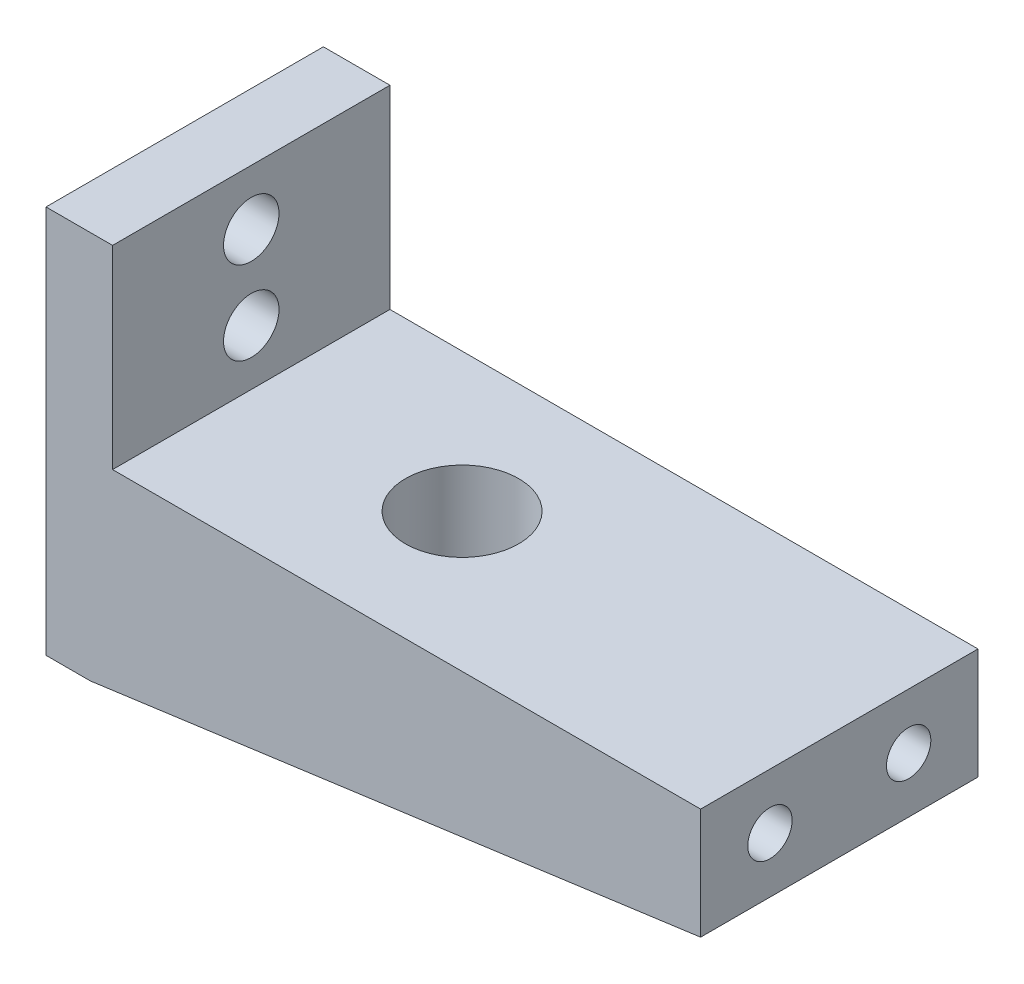
ISO-10303-21;
HEADER;
FILE_DESCRIPTION(('STEP AP214'),'2;1');
FILE_NAME('part.step','',(''),(''),'','','');
FILE_SCHEMA(('AUTOMOTIVE_DESIGN { 1 0 10303 214 1 1 1 1 }'));
ENDSEC;
DATA;
#1=APPLICATION_CONTEXT('core data for automotive mechanical design processes');
#2=APPLICATION_PROTOCOL_DEFINITION('international standard','automotive_design',2000,#1);
#3=PRODUCT_CONTEXT('',#1,'mechanical');
#4=PRODUCT('Part','Part','',(#3));
#5=PRODUCT_RELATED_PRODUCT_CATEGORY('part','',(#4));
#6=PRODUCT_DEFINITION_FORMATION('','',#4);
#7=PRODUCT_DEFINITION_CONTEXT('part definition',#1,'design');
#8=PRODUCT_DEFINITION('design','',#6,#7);
#9=PRODUCT_DEFINITION_SHAPE('','',#8);
#10=(LENGTH_UNIT() NAMED_UNIT(*) SI_UNIT(.MILLI.,.METRE.));
#11=(NAMED_UNIT(*) PLANE_ANGLE_UNIT() SI_UNIT($,.RADIAN.));
#12=(NAMED_UNIT(*) SI_UNIT($,.STERADIAN.) SOLID_ANGLE_UNIT());
#13=UNCERTAINTY_MEASURE_WITH_UNIT(LENGTH_MEASURE(1.E-05),#10,'distance_accuracy_value','');
#14=(GEOMETRIC_REPRESENTATION_CONTEXT(3) GLOBAL_UNCERTAINTY_ASSIGNED_CONTEXT((#13)) GLOBAL_UNIT_ASSIGNED_CONTEXT((#10,
#11,#12)) REPRESENTATION_CONTEXT('',''));
#15=CARTESIAN_POINT('',(0.,0.,0.));
#16=DIRECTION('',(0.,0.,1.));
#17=DIRECTION('',(1.,0.,0.));
#18=AXIS2_PLACEMENT_3D('',#15,#16,#17);
#19=CARTESIAN_POINT('',(4.,20.3125,8.17307692307693));
#20=DIRECTION('',(0.,0.,-1.));
#21=DIRECTION('',(0.,1.,0.));
#22=AXIS2_PLACEMENT_3D('',#19,#20,#21);
#23=PLANE('',#22);
#24=DIRECTION('',(-1.,0.,0.));
#25=VECTOR('',#24,1.);
#26=CARTESIAN_POINT('',(4.,-14.6875,8.17307692307692));
#27=LINE('',#26,#25);
#28=CARTESIAN_POINT('',(4.,-14.6875,8.17307692307693));
#29=VERTEX_POINT('',#28);
#30=CARTESIAN_POINT('',(0.,-14.6875,8.17307692307692));
#31=VERTEX_POINT('',#30);
#32=EDGE_CURVE('E11',#29,#31,#27,.T.);
#33=ORIENTED_EDGE('',*,*,#32,.F.);
#34=DIRECTION('',(0.990830168044299,0.135113204733314,0.));
#35=VECTOR('',#34,1.);
#36=CARTESIAN_POINT('',(4.,-14.6875,8.17307692307693));
#37=LINE('',#36,#35);
#38=CARTESIAN_POINT('',(59.,-7.1875,8.17307692307693));
#39=VERTEX_POINT('',#38);
#40=EDGE_CURVE('E98',#29,#39,#37,.T.);
#41=ORIENTED_EDGE('',*,*,#40,.T.);
#42=DIRECTION('',(0.,-1.,0.));
#43=VECTOR('',#42,1.);
#44=CARTESIAN_POINT('',(59.,2.8125,8.17307692307693));
#45=LINE('',#44,#43);
#46=CARTESIAN_POINT('',(59.,2.8125,8.17307692307693));
#47=VERTEX_POINT('',#46);
#48=EDGE_CURVE('E145',#47,#39,#45,.T.);
#49=ORIENTED_EDGE('',*,*,#48,.F.);
#50=DIRECTION('',(-1.,0.,0.));
#51=VECTOR('',#50,1.);
#52=CARTESIAN_POINT('',(59.,2.8125,8.17307692307693));
#53=LINE('',#52,#51);
#54=CARTESIAN_POINT('',(6.,2.8125,8.17307692307693));
#55=VERTEX_POINT('',#54);
#56=EDGE_CURVE('E137',#47,#55,#53,.T.);
#57=ORIENTED_EDGE('',*,*,#56,.T.);
#58=DIRECTION('',(0.,-1.,0.));
#59=VECTOR('',#58,1.);
#60=CARTESIAN_POINT('',(6.,20.3125,8.17307692307693));
#61=LINE('',#60,#59);
#62=CARTESIAN_POINT('',(6.,20.3125,8.17307692307693));
#63=VERTEX_POINT('',#62);
#64=EDGE_CURVE('E132',#63,#55,#61,.T.);
#65=ORIENTED_EDGE('',*,*,#64,.F.);
#66=DIRECTION('',(-1.,0.,0.));
#67=VECTOR('',#66,1.);
#68=CARTESIAN_POINT('',(4.,20.3125,8.17307692307693));
#69=LINE('',#68,#67);
#70=CARTESIAN_POINT('',(0.,20.3125,8.17307692307693));
#71=VERTEX_POINT('',#70);
#72=EDGE_CURVE('E102',#63,#71,#69,.T.);
#73=ORIENTED_EDGE('',*,*,#72,.T.);
#74=DIRECTION('',(0.,-1.,0.));
#75=VECTOR('',#74,1.);
#76=CARTESIAN_POINT('',(0.,20.3125,8.17307692307693));
#77=LINE('',#76,#75);
#78=EDGE_CURVE('E120',#71,#31,#77,.T.);
#79=ORIENTED_EDGE('',*,*,#78,.T.);
#80=EDGE_LOOP('',(#33,#41,#49,#57,#65,#73,#79));
#81=FACE_BOUND('',#80,.T.);
#82=ADVANCED_FACE('F33',(#81),#23,.F.);
#83=CARTESIAN_POINT('',(4.,-14.6875,8.17307692307692));
#84=DIRECTION('',(0.,1.,0.));
#85=DIRECTION('',(0.,0.,1.));
#86=AXIS2_PLACEMENT_3D('',#83,#84,#85);
#87=PLANE('',#86);
#88=DIRECTION('',(0.,0.,-1.));
#89=VECTOR('',#88,1.);
#90=CARTESIAN_POINT('',(0.,-14.6875,8.17307692307692));
#91=LINE('',#90,#89);
#92=CARTESIAN_POINT('',(0.,-14.6875,-16.8269230769231));
#93=VERTEX_POINT('',#92);
#94=EDGE_CURVE('E111',#31,#93,#91,.T.);
#95=ORIENTED_EDGE('',*,*,#94,.T.);
#96=DIRECTION('',(-1.,0.,0.));
#97=VECTOR('',#96,1.);
#98=CARTESIAN_POINT('',(4.,-14.6875,-16.8269230769231));
#99=LINE('',#98,#97);
#100=CARTESIAN_POINT('',(4.,-14.6875,-16.8269230769231));
#101=VERTEX_POINT('',#100);
#102=EDGE_CURVE('E41',#101,#93,#99,.T.);
#103=ORIENTED_EDGE('',*,*,#102,.F.);
#104=DIRECTION('',(0.,0.,-1.));
#105=VECTOR('',#104,1.);
#106=CARTESIAN_POINT('',(4.,-14.6875,8.17307692307692));
#107=LINE('',#106,#105);
#108=EDGE_CURVE('E92',#29,#101,#107,.T.);
#109=ORIENTED_EDGE('',*,*,#108,.F.);
#110=ORIENTED_EDGE('',*,*,#32,.T.);
#111=EDGE_LOOP('',(#95,#103,#109,#110));
#112=FACE_BOUND('',#111,.T.);
#113=ADVANCED_FACE('F110',(#112),#87,.F.);
#114=CARTESIAN_POINT('',(4.,20.3125,-16.8269230769231));
#115=DIRECTION('',(0.,0.,1.));
#116=DIRECTION('',(1.,0.,0.));
#117=AXIS2_PLACEMENT_3D('',#114,#115,#116);
#118=PLANE('',#117);
#119=DIRECTION('',(0.,1.,0.));
#120=VECTOR('',#119,1.);
#121=CARTESIAN_POINT('',(0.,20.3125,-16.8269230769231));
#122=LINE('',#121,#120);
#123=CARTESIAN_POINT('',(0.,20.3125,-16.8269230769231));
#124=VERTEX_POINT('',#123);
#125=EDGE_CURVE('E56',#93,#124,#122,.T.);
#126=ORIENTED_EDGE('',*,*,#125,.T.);
#127=DIRECTION('',(-1.,0.,0.));
#128=VECTOR('',#127,1.);
#129=CARTESIAN_POINT('',(4.,20.3125,-16.8269230769231));
#130=LINE('',#129,#128);
#131=CARTESIAN_POINT('',(6.,20.3125,-16.8269230769231));
#132=VERTEX_POINT('',#131);
#133=EDGE_CURVE('E112',#132,#124,#130,.T.);
#134=ORIENTED_EDGE('',*,*,#133,.F.);
#135=DIRECTION('',(0.,1.,0.));
#136=VECTOR('',#135,1.);
#137=CARTESIAN_POINT('',(6.,20.3125,-16.8269230769231));
#138=LINE('',#137,#136);
#139=CARTESIAN_POINT('',(6.,2.8125,-16.8269230769231));
#140=VERTEX_POINT('',#139);
#141=EDGE_CURVE('E126',#140,#132,#138,.T.);
#142=ORIENTED_EDGE('',*,*,#141,.F.);
#143=DIRECTION('',(-1.,0.,0.));
#144=VECTOR('',#143,1.);
#145=CARTESIAN_POINT('',(59.,2.8125,-16.8269230769231));
#146=LINE('',#145,#144);
#147=CARTESIAN_POINT('',(59.,2.8125,-16.8269230769231));
#148=VERTEX_POINT('',#147);
#149=EDGE_CURVE('E135',#148,#140,#146,.T.);
#150=ORIENTED_EDGE('',*,*,#149,.F.);
#151=DIRECTION('',(0.,1.,0.));
#152=VECTOR('',#151,1.);
#153=CARTESIAN_POINT('',(59.,2.8125,-16.8269230769231));
#154=LINE('',#153,#152);
#155=CARTESIAN_POINT('',(59.,-7.1875,-16.8269230769231));
#156=VERTEX_POINT('',#155);
#157=EDGE_CURVE('E107',#156,#148,#154,.T.);
#158=ORIENTED_EDGE('',*,*,#157,.F.);
#159=DIRECTION('',(0.990830168044299,0.135113204733314,0.));
#160=VECTOR('',#159,1.);
#161=CARTESIAN_POINT('',(4.,-14.6875,-16.8269230769231));
#162=LINE('',#161,#160);
#163=EDGE_CURVE('E95',#101,#156,#162,.T.);
#164=ORIENTED_EDGE('',*,*,#163,.F.);
#165=ORIENTED_EDGE('',*,*,#102,.T.);
#166=EDGE_LOOP('',(#126,#134,#142,#150,#158,#164,#165));
#167=FACE_BOUND('',#166,.T.);
#168=ADVANCED_FACE('F105',(#167),#118,.F.);
#169=CARTESIAN_POINT('',(4.,20.3125,8.17307692307693));
#170=DIRECTION('',(0.,-1.,0.));
#171=DIRECTION('',(0.,0.,-1.));
#172=AXIS2_PLACEMENT_3D('',#169,#170,#171);
#173=PLANE('',#172);
#174=DIRECTION('',(0.,0.,1.));
#175=VECTOR('',#174,1.);
#176=CARTESIAN_POINT('',(0.,20.3125,8.17307692307693));
#177=LINE('',#176,#175);
#178=EDGE_CURVE('E48',#124,#71,#177,.T.);
#179=ORIENTED_EDGE('',*,*,#178,.T.);
#180=ORIENTED_EDGE('',*,*,#72,.F.);
#181=DIRECTION('',(0.,0.,1.));
#182=VECTOR('',#181,1.);
#183=CARTESIAN_POINT('',(6.,20.3125,8.17307692307693));
#184=LINE('',#183,#182);
#185=EDGE_CURVE('E122',#132,#63,#184,.T.);
#186=ORIENTED_EDGE('',*,*,#185,.F.);
#187=ORIENTED_EDGE('',*,*,#133,.T.);
#188=EDGE_LOOP('',(#179,#180,#186,#187));
#189=FACE_BOUND('',#188,.T.);
#190=ADVANCED_FACE('F203',(#189),#173,.F.);
#191=CARTESIAN_POINT('',(0.,0.,0.));
#192=DIRECTION('',(1.,0.,0.));
#193=DIRECTION('',(0.,0.,-1.));
#194=AXIS2_PLACEMENT_3D('',#191,#192,#193);
#195=PLANE('',#194);
#196=CARTESIAN_POINT('',(0.,15.3125,-4.32692307692307));
#197=DIRECTION('',(1.,0.,0.));
#198=DIRECTION('',(0.,0.,-1.));
#199=AXIS2_PLACEMENT_3D('',#196,#197,#198);
#200=CIRCLE('',#199,2.5);
#201=CARTESIAN_POINT('',(0.,15.3125,-6.82692307692307));
#202=VERTEX_POINT('',#201);
#203=EDGE_CURVE('E148',#202,#202,#200,.T.);
#204=ORIENTED_EDGE('',*,*,#203,.T.);
#205=EDGE_LOOP('',(#204));
#206=FACE_BOUND('',#205,.T.);
#207=CARTESIAN_POINT('',(0.,7.8125,-4.32692307692307));
#208=DIRECTION('',(1.,0.,0.));
#209=DIRECTION('',(0.,0.,-1.));
#210=AXIS2_PLACEMENT_3D('',#207,#208,#209);
#211=CIRCLE('',#210,2.5);
#212=CARTESIAN_POINT('',(0.,7.8125,-6.82692307692307));
#213=VERTEX_POINT('',#212);
#214=EDGE_CURVE('E151',#213,#213,#211,.T.);
#215=ORIENTED_EDGE('',*,*,#214,.T.);
#216=EDGE_LOOP('',(#215));
#217=FACE_BOUND('',#216,.T.);
#218=ORIENTED_EDGE('',*,*,#78,.F.);
#219=ORIENTED_EDGE('',*,*,#178,.F.);
#220=ORIENTED_EDGE('',*,*,#125,.F.);
#221=ORIENTED_EDGE('',*,*,#94,.F.);
#222=EDGE_LOOP('',(#218,#219,#220,#221));
#223=FACE_BOUND('',#222,.T.);
#224=ADVANCED_FACE('F200',(#206,#217,#223),#195,.F.);
#225=CARTESIAN_POINT('',(6.,0.,0.));
#226=DIRECTION('',(1.,0.,0.));
#227=DIRECTION('',(0.,0.,-1.));
#228=AXIS2_PLACEMENT_3D('',#225,#226,#227);
#229=PLANE('',#228);
#230=CARTESIAN_POINT('',(6.,15.3125,-4.32692307692307));
#231=DIRECTION('',(1.,0.,0.));
#232=DIRECTION('',(0.,0.,-1.));
#233=AXIS2_PLACEMENT_3D('',#230,#231,#232);
#234=CIRCLE('',#233,2.5);
#235=CARTESIAN_POINT('',(6.,15.3125,-6.82692307692307));
#236=VERTEX_POINT('',#235);
#237=EDGE_CURVE('E154',#236,#236,#234,.T.);
#238=ORIENTED_EDGE('',*,*,#237,.F.);
#239=EDGE_LOOP('',(#238));
#240=FACE_BOUND('',#239,.T.);
#241=CARTESIAN_POINT('',(6.,7.8125,-4.32692307692307));
#242=DIRECTION('',(1.,0.,0.));
#243=DIRECTION('',(0.,0.,-1.));
#244=AXIS2_PLACEMENT_3D('',#241,#242,#243);
#245=CIRCLE('',#244,2.5);
#246=CARTESIAN_POINT('',(6.,7.8125,-6.82692307692307));
#247=VERTEX_POINT('',#246);
#248=EDGE_CURVE('E108',#247,#247,#245,.T.);
#249=ORIENTED_EDGE('',*,*,#248,.F.);
#250=EDGE_LOOP('',(#249));
#251=FACE_BOUND('',#250,.T.);
#252=ORIENTED_EDGE('',*,*,#64,.T.);
#253=DIRECTION('',(0.,0.,-1.));
#254=VECTOR('',#253,1.);
#255=CARTESIAN_POINT('',(6.,2.8125,8.17307692307693));
#256=LINE('',#255,#254);
#257=EDGE_CURVE('E129',#55,#140,#256,.T.);
#258=ORIENTED_EDGE('',*,*,#257,.T.);
#259=ORIENTED_EDGE('',*,*,#141,.T.);
#260=ORIENTED_EDGE('',*,*,#185,.T.);
#261=EDGE_LOOP('',(#252,#258,#259,#260));
#262=FACE_BOUND('',#261,.T.);
#263=ADVANCED_FACE('F202',(#240,#251,#262),#229,.T.);
#264=CARTESIAN_POINT('',(59.,2.8125,8.17307692307693));
#265=DIRECTION('',(0.,-1.,0.));
#266=DIRECTION('',(0.,0.,-1.));
#267=AXIS2_PLACEMENT_3D('',#264,#265,#266);
#268=PLANE('',#267);
#269=CARTESIAN_POINT('',(25.,2.8125,-4.32692307692307));
#270=DIRECTION('',(0.,1.,0.));
#271=DIRECTION('',(0.,0.,1.));
#272=AXIS2_PLACEMENT_3D('',#269,#270,#271);
#273=CIRCLE('',#272,5.1);
#274=CARTESIAN_POINT('',(25.,2.8125,0.773076923076928));
#275=VERTEX_POINT('',#274);
#276=EDGE_CURVE('E159',#275,#275,#273,.T.);
#277=ORIENTED_EDGE('',*,*,#276,.F.);
#278=EDGE_LOOP('',(#277));
#279=FACE_BOUND('',#278,.T.);
#280=ORIENTED_EDGE('',*,*,#257,.F.);
#281=ORIENTED_EDGE('',*,*,#56,.F.);
#282=DIRECTION('',(0.,0.,1.));
#283=VECTOR('',#282,1.);
#284=CARTESIAN_POINT('',(59.,2.8125,8.17307692307693));
#285=LINE('',#284,#283);
#286=EDGE_CURVE('E140',#148,#47,#285,.T.);
#287=ORIENTED_EDGE('',*,*,#286,.F.);
#288=ORIENTED_EDGE('',*,*,#149,.T.);
#289=EDGE_LOOP('',(#280,#281,#287,#288));
#290=FACE_BOUND('',#289,.T.);
#291=ADVANCED_FACE('F189',(#279,#290),#268,.F.);
#292=CARTESIAN_POINT('',(59.,0.,0.));
#293=DIRECTION('',(1.,0.,0.));
#294=DIRECTION('',(0.,0.,-1.));
#295=AXIS2_PLACEMENT_3D('',#292,#293,#294);
#296=PLANE('',#295);
#297=CARTESIAN_POINT('',(59.,-2.1875,1.92307692307692));
#298=DIRECTION('',(1.,0.,0.));
#299=DIRECTION('',(0.,0.,-1.));
#300=AXIS2_PLACEMENT_3D('',#297,#298,#299);
#301=CIRCLE('',#300,2.);
#302=CARTESIAN_POINT('',(59.,-2.1875,-0.0769230769230751));
#303=VERTEX_POINT('',#302);
#304=EDGE_CURVE('E170',#303,#303,#301,.T.);
#305=ORIENTED_EDGE('',*,*,#304,.F.);
#306=EDGE_LOOP('',(#305));
#307=FACE_BOUND('',#306,.T.);
#308=CARTESIAN_POINT('',(59.,-2.1875,-10.5769230769231));
#309=DIRECTION('',(1.,0.,0.));
#310=DIRECTION('',(0.,0.,-1.));
#311=AXIS2_PLACEMENT_3D('',#308,#309,#310);
#312=CIRCLE('',#311,2.);
#313=CARTESIAN_POINT('',(59.,-2.1875,-12.5769230769231));
#314=VERTEX_POINT('',#313);
#315=EDGE_CURVE('E164',#314,#314,#312,.T.);
#316=ORIENTED_EDGE('',*,*,#315,.F.);
#317=EDGE_LOOP('',(#316));
#318=FACE_BOUND('',#317,.T.);
#319=ORIENTED_EDGE('',*,*,#48,.T.);
#320=DIRECTION('',(0.,0.,-1.));
#321=VECTOR('',#320,1.);
#322=CARTESIAN_POINT('',(59.,-7.1875,8.17307692307693));
#323=LINE('',#322,#321);
#324=EDGE_CURVE('E143',#39,#156,#323,.T.);
#325=ORIENTED_EDGE('',*,*,#324,.T.);
#326=ORIENTED_EDGE('',*,*,#157,.T.);
#327=ORIENTED_EDGE('',*,*,#286,.T.);
#328=EDGE_LOOP('',(#319,#325,#326,#327));
#329=FACE_BOUND('',#328,.T.);
#330=ADVANCED_FACE('F185',(#307,#318,#329),#296,.T.);
#331=CARTESIAN_POINT('',(-49.,7.8125,-4.32692307692307));
#332=DIRECTION('',(1.,0.,0.));
#333=DIRECTION('',(0.,0.,-1.));
#334=AXIS2_PLACEMENT_3D('',#331,#332,#333);
#335=CYLINDRICAL_SURFACE('',#334,2.5);
#336=ORIENTED_EDGE('',*,*,#248,.T.);
#337=EDGE_LOOP('',(#336));
#338=FACE_BOUND('',#337,.T.);
#339=ORIENTED_EDGE('',*,*,#214,.F.);
#340=EDGE_LOOP('',(#339));
#341=FACE_BOUND('',#340,.T.);
#342=ADVANCED_FACE('F188',(#338,#341),#335,.F.);
#343=CARTESIAN_POINT('',(-49.,15.3125,-4.32692307692307));
#344=DIRECTION('',(1.,0.,0.));
#345=DIRECTION('',(0.,0.,-1.));
#346=AXIS2_PLACEMENT_3D('',#343,#344,#345);
#347=CYLINDRICAL_SURFACE('',#346,2.5);
#348=ORIENTED_EDGE('',*,*,#237,.T.);
#349=EDGE_LOOP('',(#348));
#350=FACE_BOUND('',#349,.T.);
#351=ORIENTED_EDGE('',*,*,#203,.F.);
#352=EDGE_LOOP('',(#351));
#353=FACE_BOUND('',#352,.T.);
#354=ADVANCED_FACE('F253',(#350,#353),#347,.F.);
#355=CARTESIAN_POINT('',(4.,-14.6875,-16.8269230769231));
#356=DIRECTION('',(0.135113204733314,-0.990830168044299,0.));
#357=DIRECTION('',(0.990830168044299,0.135113204733314,0.));
#358=AXIS2_PLACEMENT_3D('',#355,#356,#357);
#359=PLANE('',#358);
#360=CARTESIAN_POINT('',(25.,-11.8238636363636,-4.32692307692307));
#361=DIRECTION('',(0.135113204733314,-0.990830168044299,0.));
#362=DIRECTION('',(0.990830168044299,0.135113204733314,0.));
#363=AXIS2_PLACEMENT_3D('',#360,#361,#362);
#364=ELLIPSE('',#363,5.14719894940864,5.1);
#365=CARTESIAN_POINT('',(30.1,-11.1284090909091,-4.32692307692307));
#366=VERTEX_POINT('',#365);
#367=EDGE_CURVE('E36',#366,#366,#364,.T.);
#368=ORIENTED_EDGE('',*,*,#367,.F.);
#369=EDGE_LOOP('',(#368));
#370=FACE_BOUND('',#369,.T.);
#371=ORIENTED_EDGE('',*,*,#40,.F.);
#372=ORIENTED_EDGE('',*,*,#108,.T.);
#373=ORIENTED_EDGE('',*,*,#163,.T.);
#374=ORIENTED_EDGE('',*,*,#324,.F.);
#375=EDGE_LOOP('',(#371,#372,#373,#374));
#376=FACE_BOUND('',#375,.T.);
#377=ADVANCED_FACE('F94',(#370,#376),#359,.T.);
#378=CARTESIAN_POINT('',(25.,-1.1875,-4.32692307692307));
#379=DIRECTION('',(0.,1.,0.));
#380=DIRECTION('',(0.,0.,1.));
#381=AXIS2_PLACEMENT_3D('',#378,#379,#380);
#382=CYLINDRICAL_SURFACE('',#381,5.1);
#383=ORIENTED_EDGE('',*,*,#276,.T.);
#384=EDGE_LOOP('',(#383));
#385=FACE_BOUND('',#384,.T.);
#386=ORIENTED_EDGE('',*,*,#367,.T.);
#387=EDGE_LOOP('',(#386));
#388=FACE_BOUND('',#387,.T.);
#389=ADVANCED_FACE('F314',(#385,#388),#382,.F.);
#390=CARTESIAN_POINT('',(39.,-2.1875,-10.5769230769231));
#391=DIRECTION('',(1.,0.,0.));
#392=DIRECTION('',(0.,0.,-1.));
#393=AXIS2_PLACEMENT_3D('',#390,#391,#392);
#394=CYLINDRICAL_SURFACE('',#393,2.);
#395=CARTESIAN_POINT('',(39.,-2.1875,-10.5769230769231));
#396=DIRECTION('',(1.,0.,0.));
#397=DIRECTION('',(0.,0.,-1.));
#398=AXIS2_PLACEMENT_3D('',#395,#396,#397);
#399=CIRCLE('',#398,2.);
#400=CARTESIAN_POINT('',(39.,-2.1875,-12.5769230769231));
#401=VERTEX_POINT('',#400);
#402=EDGE_CURVE('E167',#401,#401,#399,.T.);
#403=ORIENTED_EDGE('',*,*,#402,.F.);
#404=EDGE_LOOP('',(#403));
#405=FACE_BOUND('',#404,.T.);
#406=ORIENTED_EDGE('',*,*,#315,.T.);
#407=EDGE_LOOP('',(#406));
#408=FACE_BOUND('',#407,.T.);
#409=ADVANCED_FACE('F309',(#405,#408),#394,.F.);
#410=CARTESIAN_POINT('',(39.,-2.1875,-10.5769230769231));
#411=DIRECTION('',(1.,0.,0.));
#412=DIRECTION('',(0.,0.,-1.));
#413=AXIS2_PLACEMENT_3D('',#410,#411,#412);
#414=PLANE('',#413);
#415=ORIENTED_EDGE('',*,*,#402,.T.);
#416=EDGE_LOOP('',(#415));
#417=FACE_BOUND('',#416,.T.);
#418=ADVANCED_FACE('F181',(#417),#414,.T.);
#419=CARTESIAN_POINT('',(39.,-2.1875,1.92307692307692));
#420=DIRECTION('',(1.,0.,0.));
#421=DIRECTION('',(0.,0.,-1.));
#422=AXIS2_PLACEMENT_3D('',#419,#420,#421);
#423=CYLINDRICAL_SURFACE('',#422,2.);
#424=CARTESIAN_POINT('',(39.,-2.1875,1.92307692307692));
#425=DIRECTION('',(1.,0.,0.));
#426=DIRECTION('',(0.,0.,-1.));
#427=AXIS2_PLACEMENT_3D('',#424,#425,#426);
#428=CIRCLE('',#427,2.);
#429=CARTESIAN_POINT('',(39.,-2.1875,-0.0769230769230751));
#430=VERTEX_POINT('',#429);
#431=EDGE_CURVE('E163',#430,#430,#428,.T.);
#432=ORIENTED_EDGE('',*,*,#431,.F.);
#433=EDGE_LOOP('',(#432));
#434=FACE_BOUND('',#433,.T.);
#435=ORIENTED_EDGE('',*,*,#304,.T.);
#436=EDGE_LOOP('',(#435));
#437=FACE_BOUND('',#436,.T.);
#438=ADVANCED_FACE('F178',(#434,#437),#423,.F.);
#439=CARTESIAN_POINT('',(39.,-2.1875,1.92307692307692));
#440=DIRECTION('',(1.,0.,0.));
#441=DIRECTION('',(0.,0.,-1.));
#442=AXIS2_PLACEMENT_3D('',#439,#440,#441);
#443=PLANE('',#442);
#444=ORIENTED_EDGE('',*,*,#431,.T.);
#445=EDGE_LOOP('',(#444));
#446=FACE_BOUND('',#445,.T.);
#447=ADVANCED_FACE('F176',(#446),#443,.T.);
#448=CLOSED_SHELL('',(#82,#113,#168,#190,#224,#263,#291,#330,#342,#354,#377,#389,#409,#418,#438,#447));
#449=MANIFOLD_SOLID_BREP('B2',#448);
#450=ADVANCED_BREP_SHAPE_REPRESENTATION('',(#18,#449),#14);
#451=SHAPE_DEFINITION_REPRESENTATION(#9,#450);
ENDSEC;
END-ISO-10303-21;
